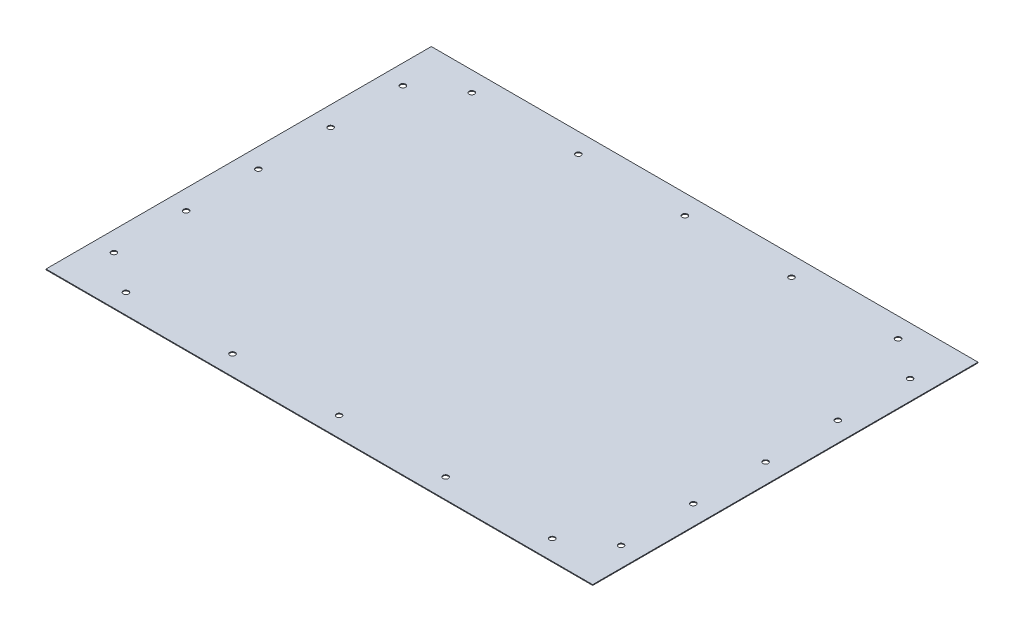
ISO-10303-21;
HEADER;
FILE_DESCRIPTION(('STEP AP214'),'2;1');
FILE_NAME('part.step','',(''),(''),'','','');
FILE_SCHEMA(('AUTOMOTIVE_DESIGN { 1 0 10303 214 1 1 1 1 }'));
ENDSEC;
DATA;
#1=APPLICATION_CONTEXT('core data for automotive mechanical design processes');
#2=APPLICATION_PROTOCOL_DEFINITION('international standard','automotive_design',2000,#1);
#3=PRODUCT_CONTEXT('',#1,'mechanical');
#4=PRODUCT('Part','Part','',(#3));
#5=PRODUCT_RELATED_PRODUCT_CATEGORY('part','',(#4));
#6=PRODUCT_DEFINITION_FORMATION('','',#4);
#7=PRODUCT_DEFINITION_CONTEXT('part definition',#1,'design');
#8=PRODUCT_DEFINITION('design','',#6,#7);
#9=PRODUCT_DEFINITION_SHAPE('','',#8);
#10=(LENGTH_UNIT() NAMED_UNIT(*) SI_UNIT(.MILLI.,.METRE.));
#11=(NAMED_UNIT(*) PLANE_ANGLE_UNIT() SI_UNIT($,.RADIAN.));
#12=(NAMED_UNIT(*) SI_UNIT($,.STERADIAN.) SOLID_ANGLE_UNIT());
#13=UNCERTAINTY_MEASURE_WITH_UNIT(LENGTH_MEASURE(1.E-05),#10,'distance_accuracy_value','');
#14=(GEOMETRIC_REPRESENTATION_CONTEXT(3) GLOBAL_UNCERTAINTY_ASSIGNED_CONTEXT((#13)) GLOBAL_UNIT_ASSIGNED_CONTEXT((#10,
#11,#12)) REPRESENTATION_CONTEXT('',''));
#15=CARTESIAN_POINT('',(0.,0.,0.));
#16=DIRECTION('',(0.,0.,1.));
#17=DIRECTION('',(1.,0.,0.));
#18=AXIS2_PLACEMENT_3D('',#15,#16,#17);
#19=CARTESIAN_POINT('',(0.,0.635,0.));
#20=DIRECTION('',(0.,1.,0.));
#21=DIRECTION('',(0.,0.,1.));
#22=AXIS2_PLACEMENT_3D('',#19,#20,#21);
#23=PLANE('',#22);
#24=CARTESIAN_POINT('',(224.699378881987,0.635,-33.2391304347827));
#25=DIRECTION('',(0.,-1.,0.));
#26=DIRECTION('',(0.,0.,1.));
#27=AXIS2_PLACEMENT_3D('',#24,#25,#26);
#28=CIRCLE('',#27,2.248);
#29=CARTESIAN_POINT('',(224.699378881987,0.635,-30.9911304347827));
#30=VERTEX_POINT('',#29);
#31=EDGE_CURVE('E167',#30,#30,#28,.T.);
#32=ORIENTED_EDGE('',*,*,#31,.T.);
#33=EDGE_LOOP('',(#32));
#34=FACE_BOUND('',#33,.T.);
#35=CARTESIAN_POINT('',(224.699378881987,0.635,86.7608695652173));
#36=DIRECTION('',(0.,-1.,0.));
#37=DIRECTION('',(0.,0.,1.));
#38=AXIS2_PLACEMENT_3D('',#35,#36,#37);
#39=CIRCLE('',#38,2.248);
#40=CARTESIAN_POINT('',(224.699378881987,0.635,89.0088695652173));
#41=VERTEX_POINT('',#40);
#42=EDGE_CURVE('E161',#41,#41,#39,.T.);
#43=ORIENTED_EDGE('',*,*,#42,.T.);
#44=EDGE_LOOP('',(#43));
#45=FACE_BOUND('',#44,.T.);
#46=CARTESIAN_POINT('',(-196.500621118013,0.635,-93.2391304347826));
#47=DIRECTION('',(0.,1.,0.));
#48=DIRECTION('',(0.,0.,1.));
#49=AXIS2_PLACEMENT_3D('',#46,#47,#48);
#50=CIRCLE('',#49,2.248);
#51=CARTESIAN_POINT('',(-196.500621118013,0.635,-90.9911304347826));
#52=VERTEX_POINT('',#51);
#53=EDGE_CURVE('E44',#52,#52,#50,.T.);
#54=ORIENTED_EDGE('',*,*,#53,.F.);
#55=EDGE_LOOP('',(#54));
#56=FACE_BOUND('',#55,.T.);
#57=CARTESIAN_POINT('',(-196.500621118013,0.635,-33.2391304347826));
#58=DIRECTION('',(0.,1.,0.));
#59=DIRECTION('',(0.,0.,1.));
#60=AXIS2_PLACEMENT_3D('',#57,#58,#59);
#61=CIRCLE('',#60,2.248);
#62=CARTESIAN_POINT('',(-196.500621118013,0.635,-30.9911304347826));
#63=VERTEX_POINT('',#62);
#64=EDGE_CURVE('E145',#63,#63,#61,.T.);
#65=ORIENTED_EDGE('',*,*,#64,.F.);
#66=EDGE_LOOP('',(#65));
#67=FACE_BOUND('',#66,.T.);
#68=CARTESIAN_POINT('',(-196.500621118013,0.635,26.7608695652174));
#69=DIRECTION('',(0.,1.,0.));
#70=DIRECTION('',(0.,0.,1.));
#71=AXIS2_PLACEMENT_3D('',#68,#69,#70);
#72=CIRCLE('',#71,2.248);
#73=CARTESIAN_POINT('',(-196.500621118013,0.635,29.0088695652174));
#74=VERTEX_POINT('',#73);
#75=EDGE_CURVE('E134',#74,#74,#72,.T.);
#76=ORIENTED_EDGE('',*,*,#75,.F.);
#77=EDGE_LOOP('',(#76));
#78=FACE_BOUND('',#77,.T.);
#79=CARTESIAN_POINT('',(191.099378881987,0.635,-116.839130434783));
#80=DIRECTION('',(0.,-1.,0.));
#81=DIRECTION('',(0.,0.,-1.));
#82=AXIS2_PLACEMENT_3D('',#79,#80,#81);
#83=CIRCLE('',#82,2.248);
#84=CARTESIAN_POINT('',(191.099378881987,0.635,-119.087130434783));
#85=VERTEX_POINT('',#84);
#86=EDGE_CURVE('E138',#85,#85,#83,.T.);
#87=ORIENTED_EDGE('',*,*,#86,.T.);
#88=EDGE_LOOP('',(#87));
#89=FACE_BOUND('',#88,.T.);
#90=CARTESIAN_POINT('',(14.0993788819874,0.635,-116.839130434783));
#91=DIRECTION('',(0.,-1.,0.));
#92=DIRECTION('',(0.,0.,-1.));
#93=AXIS2_PLACEMENT_3D('',#90,#91,#92);
#94=CIRCLE('',#93,2.248);
#95=CARTESIAN_POINT('',(14.0993788819874,0.635,-119.087130434783));
#96=VERTEX_POINT('',#95);
#97=EDGE_CURVE('E200',#96,#96,#94,.T.);
#98=ORIENTED_EDGE('',*,*,#97,.T.);
#99=EDGE_LOOP('',(#98));
#100=FACE_BOUND('',#99,.T.);
#101=CARTESIAN_POINT('',(-162.900621118013,0.635,-116.839130434783));
#102=DIRECTION('',(0.,-1.,0.));
#103=DIRECTION('',(0.,0.,-1.));
#104=AXIS2_PLACEMENT_3D('',#101,#102,#103);
#105=CIRCLE('',#104,2.248);
#106=CARTESIAN_POINT('',(-162.900621118013,0.635,-119.087130434783));
#107=VERTEX_POINT('',#106);
#108=EDGE_CURVE('E212',#107,#107,#105,.T.);
#109=ORIENTED_EDGE('',*,*,#108,.T.);
#110=EDGE_LOOP('',(#109));
#111=FACE_BOUND('',#110,.T.);
#112=CARTESIAN_POINT('',(-74.4006211180126,0.635,170.360869565217));
#113=DIRECTION('',(0.,1.,0.));
#114=DIRECTION('',(0.,0.,1.));
#115=AXIS2_PLACEMENT_3D('',#112,#113,#114);
#116=CIRCLE('',#115,2.248);
#117=CARTESIAN_POINT('',(-74.4006211180126,0.635,172.608869565217));
#118=VERTEX_POINT('',#117);
#119=EDGE_CURVE('E223',#118,#118,#116,.T.);
#120=ORIENTED_EDGE('',*,*,#119,.F.);
#121=EDGE_LOOP('',(#120));
#122=FACE_BOUND('',#121,.T.);
#123=CARTESIAN_POINT('',(-162.900621118013,0.635,170.360869565217));
#124=DIRECTION('',(0.,1.,0.));
#125=DIRECTION('',(0.,0.,1.));
#126=AXIS2_PLACEMENT_3D('',#123,#124,#125);
#127=CIRCLE('',#126,2.248);
#128=CARTESIAN_POINT('',(-162.900621118013,0.635,172.608869565217));
#129=VERTEX_POINT('',#128);
#130=EDGE_CURVE('E226',#129,#129,#127,.T.);
#131=ORIENTED_EDGE('',*,*,#130,.F.);
#132=EDGE_LOOP('',(#131));
#133=FACE_BOUND('',#132,.T.);
#134=DIRECTION('',(0.,0.,1.));
#135=VECTOR('',#134,1.);
#136=CARTESIAN_POINT('',(-212.900621118013,0.635,-133.239130434783));
#137=LINE('',#136,#135);
#138=CARTESIAN_POINT('',(-212.900621118013,0.635,-133.239130434783));
#139=VERTEX_POINT('',#138);
#140=CARTESIAN_POINT('',(-212.900621118013,0.635,186.760869565217));
#141=VERTEX_POINT('',#140);
#142=EDGE_CURVE('E87',#139,#141,#137,.T.);
#143=ORIENTED_EDGE('',*,*,#142,.T.);
#144=DIRECTION('',(1.,0.,0.));
#145=VECTOR('',#144,1.);
#146=CARTESIAN_POINT('',(-212.900621118013,0.635,186.760869565217));
#147=LINE('',#146,#145);
#148=CARTESIAN_POINT('',(241.099378881987,0.635,186.760869565217));
#149=VERTEX_POINT('',#148);
#150=EDGE_CURVE('E79',#141,#149,#147,.T.);
#151=ORIENTED_EDGE('',*,*,#150,.T.);
#152=DIRECTION('',(0.,0.,1.));
#153=VECTOR('',#152,1.);
#154=CARTESIAN_POINT('',(241.099378881987,0.635,-133.239130434783));
#155=LINE('',#154,#153);
#156=CARTESIAN_POINT('',(241.099378881987,0.635,-133.239130434783));
#157=VERTEX_POINT('',#156);
#158=EDGE_CURVE('E86',#157,#149,#155,.T.);
#159=ORIENTED_EDGE('',*,*,#158,.F.);
#160=DIRECTION('',(1.,0.,0.));
#161=VECTOR('',#160,1.);
#162=CARTESIAN_POINT('',(-212.900621118013,0.635,-133.239130434783));
#163=LINE('',#162,#161);
#164=EDGE_CURVE('E99',#139,#157,#163,.T.);
#165=ORIENTED_EDGE('',*,*,#164,.F.);
#166=EDGE_LOOP('',(#143,#151,#159,#165));
#167=FACE_BOUND('',#166,.T.);
#168=CARTESIAN_POINT('',(14.0993788819874,0.635,170.360869565217));
#169=DIRECTION('',(0.,1.,0.));
#170=DIRECTION('',(0.,0.,1.));
#171=AXIS2_PLACEMENT_3D('',#168,#169,#170);
#172=CIRCLE('',#171,2.248);
#173=CARTESIAN_POINT('',(14.0993788819874,0.635,172.608869565217));
#174=VERTEX_POINT('',#173);
#175=EDGE_CURVE('E119',#174,#174,#172,.T.);
#176=ORIENTED_EDGE('',*,*,#175,.F.);
#177=EDGE_LOOP('',(#176));
#178=FACE_BOUND('',#177,.T.);
#179=CARTESIAN_POINT('',(102.599378881987,0.635,170.360869565217));
#180=DIRECTION('',(0.,1.,0.));
#181=DIRECTION('',(0.,0.,1.));
#182=AXIS2_PLACEMENT_3D('',#179,#180,#181);
#183=CIRCLE('',#182,2.248);
#184=CARTESIAN_POINT('',(102.599378881987,0.635,172.608869565217));
#185=VERTEX_POINT('',#184);
#186=EDGE_CURVE('E125',#185,#185,#183,.T.);
#187=ORIENTED_EDGE('',*,*,#186,.F.);
#188=EDGE_LOOP('',(#187));
#189=FACE_BOUND('',#188,.T.);
#190=CARTESIAN_POINT('',(191.099378881987,0.635,170.360869565217));
#191=DIRECTION('',(0.,1.,0.));
#192=DIRECTION('',(0.,0.,1.));
#193=AXIS2_PLACEMENT_3D('',#190,#191,#192);
#194=CIRCLE('',#193,2.248);
#195=CARTESIAN_POINT('',(191.099378881987,0.635,172.608869565217));
#196=VERTEX_POINT('',#195);
#197=EDGE_CURVE('E131',#196,#196,#194,.T.);
#198=ORIENTED_EDGE('',*,*,#197,.F.);
#199=EDGE_LOOP('',(#198));
#200=FACE_BOUND('',#199,.T.);
#201=CARTESIAN_POINT('',(-74.4006211180126,0.635,-116.839130434783));
#202=DIRECTION('',(0.,-1.,0.));
#203=DIRECTION('',(0.,0.,-1.));
#204=AXIS2_PLACEMENT_3D('',#201,#202,#203);
#205=CIRCLE('',#204,2.248);
#206=CARTESIAN_POINT('',(-74.4006211180126,0.635,-119.087130434783));
#207=VERTEX_POINT('',#206);
#208=EDGE_CURVE('E206',#207,#207,#205,.T.);
#209=ORIENTED_EDGE('',*,*,#208,.T.);
#210=EDGE_LOOP('',(#209));
#211=FACE_BOUND('',#210,.T.);
#212=CARTESIAN_POINT('',(102.599378881987,0.635,-116.839130434783));
#213=DIRECTION('',(0.,-1.,0.));
#214=DIRECTION('',(0.,0.,-1.));
#215=AXIS2_PLACEMENT_3D('',#212,#213,#214);
#216=CIRCLE('',#215,2.248);
#217=CARTESIAN_POINT('',(102.599378881987,0.635,-119.087130434783));
#218=VERTEX_POINT('',#217);
#219=EDGE_CURVE('E194',#218,#218,#216,.T.);
#220=ORIENTED_EDGE('',*,*,#219,.T.);
#221=EDGE_LOOP('',(#220));
#222=FACE_BOUND('',#221,.T.);
#223=CARTESIAN_POINT('',(-196.500621118013,0.635,146.760869565217));
#224=DIRECTION('',(0.,1.,0.));
#225=DIRECTION('',(0.,0.,1.));
#226=AXIS2_PLACEMENT_3D('',#223,#224,#225);
#227=CIRCLE('',#226,2.248);
#228=CARTESIAN_POINT('',(-196.500621118013,0.635,149.008869565217));
#229=VERTEX_POINT('',#228);
#230=EDGE_CURVE('E139',#229,#229,#227,.T.);
#231=ORIENTED_EDGE('',*,*,#230,.F.);
#232=EDGE_LOOP('',(#231));
#233=FACE_BOUND('',#232,.T.);
#234=CARTESIAN_POINT('',(-196.500621118013,0.635,86.7608695652174));
#235=DIRECTION('',(0.,1.,0.));
#236=DIRECTION('',(0.,0.,1.));
#237=AXIS2_PLACEMENT_3D('',#234,#235,#236);
#238=CIRCLE('',#237,2.248);
#239=CARTESIAN_POINT('',(-196.500621118013,0.635,89.0088695652174));
#240=VERTEX_POINT('',#239);
#241=EDGE_CURVE('E156',#240,#240,#238,.T.);
#242=ORIENTED_EDGE('',*,*,#241,.F.);
#243=EDGE_LOOP('',(#242));
#244=FACE_BOUND('',#243,.T.);
#245=CARTESIAN_POINT('',(224.699378881987,0.635,146.760869565217));
#246=DIRECTION('',(0.,-1.,0.));
#247=DIRECTION('',(0.,0.,1.));
#248=AXIS2_PLACEMENT_3D('',#245,#246,#247);
#249=CIRCLE('',#248,2.248);
#250=CARTESIAN_POINT('',(224.699378881987,0.635,149.008869565217));
#251=VERTEX_POINT('',#250);
#252=EDGE_CURVE('E157',#251,#251,#249,.T.);
#253=ORIENTED_EDGE('',*,*,#252,.T.);
#254=EDGE_LOOP('',(#253));
#255=FACE_BOUND('',#254,.T.);
#256=CARTESIAN_POINT('',(224.699378881987,0.635,26.7608695652173));
#257=DIRECTION('',(0.,-1.,0.));
#258=DIRECTION('',(0.,0.,1.));
#259=AXIS2_PLACEMENT_3D('',#256,#257,#258);
#260=CIRCLE('',#259,2.248);
#261=CARTESIAN_POINT('',(224.699378881987,0.635,29.0088695652173));
#262=VERTEX_POINT('',#261);
#263=EDGE_CURVE('E164',#262,#262,#260,.T.);
#264=ORIENTED_EDGE('',*,*,#263,.T.);
#265=EDGE_LOOP('',(#264));
#266=FACE_BOUND('',#265,.T.);
#267=CARTESIAN_POINT('',(224.699378881987,0.635,-93.2391304347827));
#268=DIRECTION('',(0.,-1.,0.));
#269=DIRECTION('',(0.,0.,1.));
#270=AXIS2_PLACEMENT_3D('',#267,#268,#269);
#271=CIRCLE('',#270,2.248);
#272=CARTESIAN_POINT('',(224.699378881987,0.635,-90.9911304347827));
#273=VERTEX_POINT('',#272);
#274=EDGE_CURVE('E177',#273,#273,#271,.T.);
#275=ORIENTED_EDGE('',*,*,#274,.T.);
#276=EDGE_LOOP('',(#275));
#277=FACE_BOUND('',#276,.T.);
#278=ADVANCED_FACE('F34',(#34,#45,#56,#67,#78,#89,#100,#111,#122,#133,#167,#178,#189,#200,#211,
#222,#233,#244,#255,#266,#277),#23,.T.);
#279=CARTESIAN_POINT('',(0.,0.,0.));
#280=DIRECTION('',(0.,1.,0.));
#281=DIRECTION('',(0.,0.,1.));
#282=AXIS2_PLACEMENT_3D('',#279,#280,#281);
#283=PLANE('',#282);
#284=CARTESIAN_POINT('',(224.699378881987,0.,-33.2391304347827));
#285=DIRECTION('',(0.,1.,0.));
#286=DIRECTION('',(0.,0.,1.));
#287=AXIS2_PLACEMENT_3D('',#284,#285,#286);
#288=CIRCLE('',#287,2.248);
#289=CARTESIAN_POINT('',(224.699378881987,0.,-30.9911304347827));
#290=VERTEX_POINT('',#289);
#291=EDGE_CURVE('E165',#290,#290,#288,.F.);
#292=ORIENTED_EDGE('',*,*,#291,.F.);
#293=EDGE_LOOP('',(#292));
#294=FACE_BOUND('',#293,.T.);
#295=CARTESIAN_POINT('',(224.699378881987,0.,86.7608695652173));
#296=DIRECTION('',(0.,1.,0.));
#297=DIRECTION('',(0.,0.,1.));
#298=AXIS2_PLACEMENT_3D('',#295,#296,#297);
#299=CIRCLE('',#298,2.248);
#300=CARTESIAN_POINT('',(224.699378881987,0.,89.0088695652173));
#301=VERTEX_POINT('',#300);
#302=EDGE_CURVE('E158',#301,#301,#299,.F.);
#303=ORIENTED_EDGE('',*,*,#302,.F.);
#304=EDGE_LOOP('',(#303));
#305=FACE_BOUND('',#304,.T.);
#306=CARTESIAN_POINT('',(-196.500621118013,0.,-93.2391304347826));
#307=DIRECTION('',(0.,1.,0.));
#308=DIRECTION('',(0.,0.,1.));
#309=AXIS2_PLACEMENT_3D('',#306,#307,#308);
#310=CIRCLE('',#309,2.248);
#311=CARTESIAN_POINT('',(-196.500621118013,0.,-90.9911304347826));
#312=VERTEX_POINT('',#311);
#313=EDGE_CURVE('E11',#312,#312,#310,.T.);
#314=ORIENTED_EDGE('',*,*,#313,.T.);
#315=EDGE_LOOP('',(#314));
#316=FACE_BOUND('',#315,.T.);
#317=CARTESIAN_POINT('',(-196.500621118013,0.,-33.2391304347826));
#318=DIRECTION('',(0.,1.,0.));
#319=DIRECTION('',(0.,0.,1.));
#320=AXIS2_PLACEMENT_3D('',#317,#318,#319);
#321=CIRCLE('',#320,2.248);
#322=CARTESIAN_POINT('',(-196.500621118013,0.,-30.9911304347826));
#323=VERTEX_POINT('',#322);
#324=EDGE_CURVE('E148',#323,#323,#321,.T.);
#325=ORIENTED_EDGE('',*,*,#324,.T.);
#326=EDGE_LOOP('',(#325));
#327=FACE_BOUND('',#326,.T.);
#328=CARTESIAN_POINT('',(-196.500621118013,0.,26.7608695652174));
#329=DIRECTION('',(0.,1.,0.));
#330=DIRECTION('',(0.,0.,1.));
#331=AXIS2_PLACEMENT_3D('',#328,#329,#330);
#332=CIRCLE('',#331,2.248);
#333=CARTESIAN_POINT('',(-196.500621118013,0.,29.0088695652174));
#334=VERTEX_POINT('',#333);
#335=EDGE_CURVE('E142',#334,#334,#332,.T.);
#336=ORIENTED_EDGE('',*,*,#335,.T.);
#337=EDGE_LOOP('',(#336));
#338=FACE_BOUND('',#337,.T.);
#339=CARTESIAN_POINT('',(191.099378881987,0.,-116.839130434783));
#340=DIRECTION('',(0.,-1.,0.));
#341=DIRECTION('',(0.,0.,-1.));
#342=AXIS2_PLACEMENT_3D('',#339,#340,#341);
#343=CIRCLE('',#342,2.248);
#344=CARTESIAN_POINT('',(191.099378881987,0.,-119.087130434783));
#345=VERTEX_POINT('',#344);
#346=EDGE_CURVE('E191',#345,#345,#343,.T.);
#347=ORIENTED_EDGE('',*,*,#346,.F.);
#348=EDGE_LOOP('',(#347));
#349=FACE_BOUND('',#348,.T.);
#350=CARTESIAN_POINT('',(14.0993788819874,0.,-116.839130434783));
#351=DIRECTION('',(0.,-1.,0.));
#352=DIRECTION('',(0.,0.,-1.));
#353=AXIS2_PLACEMENT_3D('',#350,#351,#352);
#354=CIRCLE('',#353,2.248);
#355=CARTESIAN_POINT('',(14.0993788819874,0.,-119.087130434783));
#356=VERTEX_POINT('',#355);
#357=EDGE_CURVE('E203',#356,#356,#354,.T.);
#358=ORIENTED_EDGE('',*,*,#357,.F.);
#359=EDGE_LOOP('',(#358));
#360=FACE_BOUND('',#359,.T.);
#361=CARTESIAN_POINT('',(-162.900621118013,0.,-116.839130434783));
#362=DIRECTION('',(0.,-1.,0.));
#363=DIRECTION('',(0.,0.,-1.));
#364=AXIS2_PLACEMENT_3D('',#361,#362,#363);
#365=CIRCLE('',#364,2.248);
#366=CARTESIAN_POINT('',(-162.900621118013,0.,-119.087130434783));
#367=VERTEX_POINT('',#366);
#368=EDGE_CURVE('E215',#367,#367,#365,.T.);
#369=ORIENTED_EDGE('',*,*,#368,.F.);
#370=EDGE_LOOP('',(#369));
#371=FACE_BOUND('',#370,.T.);
#372=CARTESIAN_POINT('',(-74.4006211180126,0.,170.360869565217));
#373=DIRECTION('',(0.,1.,0.));
#374=DIRECTION('',(0.,0.,1.));
#375=AXIS2_PLACEMENT_3D('',#372,#373,#374);
#376=CIRCLE('',#375,2.248);
#377=CARTESIAN_POINT('',(-74.4006211180126,0.,172.608869565217));
#378=VERTEX_POINT('',#377);
#379=EDGE_CURVE('E218',#378,#378,#376,.T.);
#380=ORIENTED_EDGE('',*,*,#379,.T.);
#381=EDGE_LOOP('',(#380));
#382=FACE_BOUND('',#381,.T.);
#383=CARTESIAN_POINT('',(-162.900621118013,0.,170.360869565217));
#384=DIRECTION('',(0.,1.,0.));
#385=DIRECTION('',(0.,0.,1.));
#386=AXIS2_PLACEMENT_3D('',#383,#384,#385);
#387=CIRCLE('',#386,2.248);
#388=CARTESIAN_POINT('',(-162.900621118013,0.,172.608869565217));
#389=VERTEX_POINT('',#388);
#390=EDGE_CURVE('E106',#389,#389,#387,.T.);
#391=ORIENTED_EDGE('',*,*,#390,.T.);
#392=EDGE_LOOP('',(#391));
#393=FACE_BOUND('',#392,.T.);
#394=DIRECTION('',(0.,0.,1.));
#395=VECTOR('',#394,1.);
#396=CARTESIAN_POINT('',(-212.900621118013,0.,-133.239130434783));
#397=LINE('',#396,#395);
#398=CARTESIAN_POINT('',(-212.900621118013,0.,-133.239130434783));
#399=VERTEX_POINT('',#398);
#400=CARTESIAN_POINT('',(-212.900621118013,0.,186.760869565217));
#401=VERTEX_POINT('',#400);
#402=EDGE_CURVE('E104',#399,#401,#397,.T.);
#403=ORIENTED_EDGE('',*,*,#402,.F.);
#404=DIRECTION('',(1.,0.,0.));
#405=VECTOR('',#404,1.);
#406=CARTESIAN_POINT('',(-212.900621118013,0.,-133.239130434783));
#407=LINE('',#406,#405);
#408=CARTESIAN_POINT('',(241.099378881987,0.,-133.239130434783));
#409=VERTEX_POINT('',#408);
#410=EDGE_CURVE('E110',#399,#409,#407,.T.);
#411=ORIENTED_EDGE('',*,*,#410,.T.);
#412=DIRECTION('',(0.,0.,1.));
#413=VECTOR('',#412,1.);
#414=CARTESIAN_POINT('',(241.099378881987,0.,-133.239130434783));
#415=LINE('',#414,#413);
#416=CARTESIAN_POINT('',(241.099378881987,0.,186.760869565217));
#417=VERTEX_POINT('',#416);
#418=EDGE_CURVE('E108',#409,#417,#415,.T.);
#419=ORIENTED_EDGE('',*,*,#418,.T.);
#420=DIRECTION('',(1.,0.,0.));
#421=VECTOR('',#420,1.);
#422=CARTESIAN_POINT('',(-212.900621118013,0.,186.760869565217));
#423=LINE('',#422,#421);
#424=EDGE_CURVE('E93',#401,#417,#423,.T.);
#425=ORIENTED_EDGE('',*,*,#424,.F.);
#426=EDGE_LOOP('',(#403,#411,#419,#425));
#427=FACE_BOUND('',#426,.T.);
#428=CARTESIAN_POINT('',(14.0993788819874,0.,170.360869565217));
#429=DIRECTION('',(0.,1.,0.));
#430=DIRECTION('',(0.,0.,1.));
#431=AXIS2_PLACEMENT_3D('',#428,#429,#430);
#432=CIRCLE('',#431,2.248);
#433=CARTESIAN_POINT('',(14.0993788819874,0.,172.608869565217));
#434=VERTEX_POINT('',#433);
#435=EDGE_CURVE('E116',#434,#434,#432,.T.);
#436=ORIENTED_EDGE('',*,*,#435,.T.);
#437=EDGE_LOOP('',(#436));
#438=FACE_BOUND('',#437,.T.);
#439=CARTESIAN_POINT('',(102.599378881987,0.,170.360869565217));
#440=DIRECTION('',(0.,1.,0.));
#441=DIRECTION('',(0.,0.,1.));
#442=AXIS2_PLACEMENT_3D('',#439,#440,#441);
#443=CIRCLE('',#442,2.248);
#444=CARTESIAN_POINT('',(102.599378881987,0.,172.608869565217));
#445=VERTEX_POINT('',#444);
#446=EDGE_CURVE('E122',#445,#445,#443,.T.);
#447=ORIENTED_EDGE('',*,*,#446,.T.);
#448=EDGE_LOOP('',(#447));
#449=FACE_BOUND('',#448,.T.);
#450=CARTESIAN_POINT('',(191.099378881987,0.,170.360869565217));
#451=DIRECTION('',(0.,1.,0.));
#452=DIRECTION('',(0.,0.,1.));
#453=AXIS2_PLACEMENT_3D('',#450,#451,#452);
#454=CIRCLE('',#453,2.248);
#455=CARTESIAN_POINT('',(191.099378881987,0.,172.608869565217));
#456=VERTEX_POINT('',#455);
#457=EDGE_CURVE('E128',#456,#456,#454,.T.);
#458=ORIENTED_EDGE('',*,*,#457,.T.);
#459=EDGE_LOOP('',(#458));
#460=FACE_BOUND('',#459,.T.);
#461=CARTESIAN_POINT('',(-74.4006211180126,0.,-116.839130434783));
#462=DIRECTION('',(0.,-1.,0.));
#463=DIRECTION('',(0.,0.,-1.));
#464=AXIS2_PLACEMENT_3D('',#461,#462,#463);
#465=CIRCLE('',#464,2.248);
#466=CARTESIAN_POINT('',(-74.4006211180126,0.,-119.087130434783));
#467=VERTEX_POINT('',#466);
#468=EDGE_CURVE('E209',#467,#467,#465,.T.);
#469=ORIENTED_EDGE('',*,*,#468,.F.);
#470=EDGE_LOOP('',(#469));
#471=FACE_BOUND('',#470,.T.);
#472=CARTESIAN_POINT('',(102.599378881987,0.,-116.839130434783));
#473=DIRECTION('',(0.,-1.,0.));
#474=DIRECTION('',(0.,0.,-1.));
#475=AXIS2_PLACEMENT_3D('',#472,#473,#474);
#476=CIRCLE('',#475,2.248);
#477=CARTESIAN_POINT('',(102.599378881987,0.,-119.087130434783));
#478=VERTEX_POINT('',#477);
#479=EDGE_CURVE('E197',#478,#478,#476,.T.);
#480=ORIENTED_EDGE('',*,*,#479,.F.);
#481=EDGE_LOOP('',(#480));
#482=FACE_BOUND('',#481,.T.);
#483=CARTESIAN_POINT('',(-196.500621118013,0.,146.760869565217));
#484=DIRECTION('',(0.,1.,0.));
#485=DIRECTION('',(0.,0.,1.));
#486=AXIS2_PLACEMENT_3D('',#483,#484,#485);
#487=CIRCLE('',#486,2.248);
#488=CARTESIAN_POINT('',(-196.500621118013,0.,149.008869565217));
#489=VERTEX_POINT('',#488);
#490=EDGE_CURVE('E135',#489,#489,#487,.T.);
#491=ORIENTED_EDGE('',*,*,#490,.T.);
#492=EDGE_LOOP('',(#491));
#493=FACE_BOUND('',#492,.T.);
#494=CARTESIAN_POINT('',(-196.500621118013,0.,86.7608695652174));
#495=DIRECTION('',(0.,1.,0.));
#496=DIRECTION('',(0.,0.,1.));
#497=AXIS2_PLACEMENT_3D('',#494,#495,#496);
#498=CIRCLE('',#497,2.248);
#499=CARTESIAN_POINT('',(-196.500621118013,0.,89.0088695652174));
#500=VERTEX_POINT('',#499);
#501=EDGE_CURVE('E186',#500,#500,#498,.T.);
#502=ORIENTED_EDGE('',*,*,#501,.T.);
#503=EDGE_LOOP('',(#502));
#504=FACE_BOUND('',#503,.T.);
#505=CARTESIAN_POINT('',(224.699378881987,0.,146.760869565217));
#506=DIRECTION('',(0.,1.,0.));
#507=DIRECTION('',(0.,0.,1.));
#508=AXIS2_PLACEMENT_3D('',#505,#506,#507);
#509=CIRCLE('',#508,2.248);
#510=CARTESIAN_POINT('',(224.699378881987,0.,149.008869565217));
#511=VERTEX_POINT('',#510);
#512=EDGE_CURVE('E153',#511,#511,#509,.F.);
#513=ORIENTED_EDGE('',*,*,#512,.F.);
#514=EDGE_LOOP('',(#513));
#515=FACE_BOUND('',#514,.T.);
#516=CARTESIAN_POINT('',(224.699378881987,0.,26.7608695652173));
#517=DIRECTION('',(0.,1.,0.));
#518=DIRECTION('',(0.,0.,1.));
#519=AXIS2_PLACEMENT_3D('',#516,#517,#518);
#520=CIRCLE('',#519,2.248);
#521=CARTESIAN_POINT('',(224.699378881987,0.,29.0088695652173));
#522=VERTEX_POINT('',#521);
#523=EDGE_CURVE('E162',#522,#522,#520,.F.);
#524=ORIENTED_EDGE('',*,*,#523,.F.);
#525=EDGE_LOOP('',(#524));
#526=FACE_BOUND('',#525,.T.);
#527=CARTESIAN_POINT('',(224.699378881987,0.,-93.2391304347827));
#528=DIRECTION('',(0.,1.,0.));
#529=DIRECTION('',(0.,0.,1.));
#530=AXIS2_PLACEMENT_3D('',#527,#528,#529);
#531=CIRCLE('',#530,2.248);
#532=CARTESIAN_POINT('',(224.699378881987,0.,-90.9911304347827));
#533=VERTEX_POINT('',#532);
#534=EDGE_CURVE('E38',#533,#533,#531,.F.);
#535=ORIENTED_EDGE('',*,*,#534,.F.);
#536=EDGE_LOOP('',(#535));
#537=FACE_BOUND('',#536,.T.);
#538=ADVANCED_FACE('F235',(#294,#305,#316,#327,#338,#349,#360,#371,#382,#393,#427,#438,#449,
#460,#471,#482,#493,#504,#515,#526,#537),#283,.F.);
#539=CARTESIAN_POINT('',(-212.900621118013,0.635,-133.239130434783));
#540=DIRECTION('',(1.,0.,0.));
#541=DIRECTION('',(0.,0.,-1.));
#542=AXIS2_PLACEMENT_3D('',#539,#540,#541);
#543=PLANE('',#542);
#544=ORIENTED_EDGE('',*,*,#402,.T.);
#545=DIRECTION('',(0.,-1.,0.));
#546=VECTOR('',#545,1.);
#547=CARTESIAN_POINT('',(-212.900621118013,0.635,186.760869565217));
#548=LINE('',#547,#546);
#549=EDGE_CURVE('E96',#141,#401,#548,.T.);
#550=ORIENTED_EDGE('',*,*,#549,.F.);
#551=ORIENTED_EDGE('',*,*,#142,.F.);
#552=DIRECTION('',(0.,-1.,0.));
#553=VECTOR('',#552,1.);
#554=CARTESIAN_POINT('',(-212.900621118013,0.635,-133.239130434783));
#555=LINE('',#554,#553);
#556=EDGE_CURVE('E53',#139,#399,#555,.T.);
#557=ORIENTED_EDGE('',*,*,#556,.T.);
#558=EDGE_LOOP('',(#544,#550,#551,#557));
#559=FACE_BOUND('',#558,.T.);
#560=ADVANCED_FACE('F240',(#559),#543,.F.);
#561=CARTESIAN_POINT('',(-212.900621118013,0.635,186.760869565217));
#562=DIRECTION('',(0.,0.,-1.));
#563=DIRECTION('',(-1.,0.,0.));
#564=AXIS2_PLACEMENT_3D('',#561,#562,#563);
#565=PLANE('',#564);
#566=ORIENTED_EDGE('',*,*,#424,.T.);
#567=DIRECTION('',(0.,-1.,0.));
#568=VECTOR('',#567,1.);
#569=CARTESIAN_POINT('',(241.099378881987,0.635,186.760869565217));
#570=LINE('',#569,#568);
#571=EDGE_CURVE('E91',#149,#417,#570,.T.);
#572=ORIENTED_EDGE('',*,*,#571,.F.);
#573=ORIENTED_EDGE('',*,*,#150,.F.);
#574=ORIENTED_EDGE('',*,*,#549,.T.);
#575=EDGE_LOOP('',(#566,#572,#573,#574));
#576=FACE_BOUND('',#575,.T.);
#577=ADVANCED_FACE('F92',(#576),#565,.F.);
#578=CARTESIAN_POINT('',(241.099378881987,0.635,-133.239130434783));
#579=DIRECTION('',(1.,0.,0.));
#580=DIRECTION('',(0.,0.,-1.));
#581=AXIS2_PLACEMENT_3D('',#578,#579,#580);
#582=PLANE('',#581);
#583=ORIENTED_EDGE('',*,*,#418,.F.);
#584=DIRECTION('',(0.,-1.,0.));
#585=VECTOR('',#584,1.);
#586=CARTESIAN_POINT('',(241.099378881987,0.635,-133.239130434783));
#587=LINE('',#586,#585);
#588=EDGE_CURVE('E67',#157,#409,#587,.T.);
#589=ORIENTED_EDGE('',*,*,#588,.F.);
#590=ORIENTED_EDGE('',*,*,#158,.T.);
#591=ORIENTED_EDGE('',*,*,#571,.T.);
#592=EDGE_LOOP('',(#583,#589,#590,#591));
#593=FACE_BOUND('',#592,.T.);
#594=ADVANCED_FACE('F98',(#593),#582,.T.);
#595=CARTESIAN_POINT('',(-212.900621118013,0.635,-133.239130434783));
#596=DIRECTION('',(0.,0.,-1.));
#597=DIRECTION('',(-1.,0.,0.));
#598=AXIS2_PLACEMENT_3D('',#595,#596,#597);
#599=PLANE('',#598);
#600=ORIENTED_EDGE('',*,*,#410,.F.);
#601=ORIENTED_EDGE('',*,*,#556,.F.);
#602=ORIENTED_EDGE('',*,*,#164,.T.);
#603=ORIENTED_EDGE('',*,*,#588,.T.);
#604=EDGE_LOOP('',(#600,#601,#602,#603));
#605=FACE_BOUND('',#604,.T.);
#606=ADVANCED_FACE('F247',(#605),#599,.T.);
#607=CARTESIAN_POINT('',(-162.900621118013,0.,170.360869565217));
#608=DIRECTION('',(0.,1.,0.));
#609=DIRECTION('',(0.,0.,1.));
#610=AXIS2_PLACEMENT_3D('',#607,#608,#609);
#611=CYLINDRICAL_SURFACE('',#610,2.248);
#612=ORIENTED_EDGE('',*,*,#390,.F.);
#613=EDGE_LOOP('',(#612));
#614=FACE_BOUND('',#613,.T.);
#615=ORIENTED_EDGE('',*,*,#130,.T.);
#616=EDGE_LOOP('',(#615));
#617=FACE_BOUND('',#616,.T.);
#618=ADVANCED_FACE('F232',(#614,#617),#611,.F.);
#619=CARTESIAN_POINT('',(-74.4006211180126,0.,170.360869565217));
#620=DIRECTION('',(0.,1.,0.));
#621=DIRECTION('',(0.,0.,1.));
#622=AXIS2_PLACEMENT_3D('',#619,#620,#621);
#623=CYLINDRICAL_SURFACE('',#622,2.248);
#624=ORIENTED_EDGE('',*,*,#379,.F.);
#625=EDGE_LOOP('',(#624));
#626=FACE_BOUND('',#625,.T.);
#627=ORIENTED_EDGE('',*,*,#119,.T.);
#628=EDGE_LOOP('',(#627));
#629=FACE_BOUND('',#628,.T.);
#630=ADVANCED_FACE('F260',(#626,#629),#623,.F.);
#631=CARTESIAN_POINT('',(14.0993788819874,0.,170.360869565217));
#632=DIRECTION('',(0.,1.,0.));
#633=DIRECTION('',(0.,0.,1.));
#634=AXIS2_PLACEMENT_3D('',#631,#632,#633);
#635=CYLINDRICAL_SURFACE('',#634,2.248);
#636=ORIENTED_EDGE('',*,*,#435,.F.);
#637=EDGE_LOOP('',(#636));
#638=FACE_BOUND('',#637,.T.);
#639=ORIENTED_EDGE('',*,*,#175,.T.);
#640=EDGE_LOOP('',(#639));
#641=FACE_BOUND('',#640,.T.);
#642=ADVANCED_FACE('F256',(#638,#641),#635,.F.);
#643=CARTESIAN_POINT('',(102.599378881987,0.,170.360869565217));
#644=DIRECTION('',(0.,1.,0.));
#645=DIRECTION('',(0.,0.,1.));
#646=AXIS2_PLACEMENT_3D('',#643,#644,#645);
#647=CYLINDRICAL_SURFACE('',#646,2.248);
#648=ORIENTED_EDGE('',*,*,#446,.F.);
#649=EDGE_LOOP('',(#648));
#650=FACE_BOUND('',#649,.T.);
#651=ORIENTED_EDGE('',*,*,#186,.T.);
#652=EDGE_LOOP('',(#651));
#653=FACE_BOUND('',#652,.T.);
#654=ADVANCED_FACE('F259',(#650,#653),#647,.F.);
#655=CARTESIAN_POINT('',(191.099378881987,0.,170.360869565217));
#656=DIRECTION('',(0.,1.,0.));
#657=DIRECTION('',(0.,0.,1.));
#658=AXIS2_PLACEMENT_3D('',#655,#656,#657);
#659=CYLINDRICAL_SURFACE('',#658,2.248);
#660=ORIENTED_EDGE('',*,*,#457,.F.);
#661=EDGE_LOOP('',(#660));
#662=FACE_BOUND('',#661,.T.);
#663=ORIENTED_EDGE('',*,*,#197,.T.);
#664=EDGE_LOOP('',(#663));
#665=FACE_BOUND('',#664,.T.);
#666=ADVANCED_FACE('F264',(#662,#665),#659,.F.);
#667=CARTESIAN_POINT('',(-162.900621118013,0.,-116.839130434783));
#668=DIRECTION('',(0.,1.,0.));
#669=DIRECTION('',(0.,0.,1.));
#670=AXIS2_PLACEMENT_3D('',#667,#668,#669);
#671=CYLINDRICAL_SURFACE('',#670,2.248);
#672=ORIENTED_EDGE('',*,*,#368,.T.);
#673=EDGE_LOOP('',(#672));
#674=FACE_BOUND('',#673,.T.);
#675=ORIENTED_EDGE('',*,*,#108,.F.);
#676=EDGE_LOOP('',(#675));
#677=FACE_BOUND('',#676,.T.);
#678=ADVANCED_FACE('F268',(#674,#677),#671,.F.);
#679=CARTESIAN_POINT('',(-74.4006211180126,0.,-116.839130434783));
#680=DIRECTION('',(0.,1.,0.));
#681=DIRECTION('',(0.,0.,1.));
#682=AXIS2_PLACEMENT_3D('',#679,#680,#681);
#683=CYLINDRICAL_SURFACE('',#682,2.248);
#684=ORIENTED_EDGE('',*,*,#468,.T.);
#685=EDGE_LOOP('',(#684));
#686=FACE_BOUND('',#685,.T.);
#687=ORIENTED_EDGE('',*,*,#208,.F.);
#688=EDGE_LOOP('',(#687));
#689=FACE_BOUND('',#688,.T.);
#690=ADVANCED_FACE('F361',(#686,#689),#683,.F.);
#691=CARTESIAN_POINT('',(14.0993788819874,0.,-116.839130434783));
#692=DIRECTION('',(0.,1.,0.));
#693=DIRECTION('',(0.,0.,1.));
#694=AXIS2_PLACEMENT_3D('',#691,#692,#693);
#695=CYLINDRICAL_SURFACE('',#694,2.248);
#696=ORIENTED_EDGE('',*,*,#357,.T.);
#697=EDGE_LOOP('',(#696));
#698=FACE_BOUND('',#697,.T.);
#699=ORIENTED_EDGE('',*,*,#97,.F.);
#700=EDGE_LOOP('',(#699));
#701=FACE_BOUND('',#700,.T.);
#702=ADVANCED_FACE('F357',(#698,#701),#695,.F.);
#703=CARTESIAN_POINT('',(102.599378881987,0.,-116.839130434783));
#704=DIRECTION('',(0.,1.,0.));
#705=DIRECTION('',(0.,0.,1.));
#706=AXIS2_PLACEMENT_3D('',#703,#704,#705);
#707=CYLINDRICAL_SURFACE('',#706,2.248);
#708=ORIENTED_EDGE('',*,*,#479,.T.);
#709=EDGE_LOOP('',(#708));
#710=FACE_BOUND('',#709,.T.);
#711=ORIENTED_EDGE('',*,*,#219,.F.);
#712=EDGE_LOOP('',(#711));
#713=FACE_BOUND('',#712,.T.);
#714=ADVANCED_FACE('F353',(#710,#713),#707,.F.);
#715=CARTESIAN_POINT('',(191.099378881987,0.,-116.839130434783));
#716=DIRECTION('',(0.,1.,0.));
#717=DIRECTION('',(0.,0.,1.));
#718=AXIS2_PLACEMENT_3D('',#715,#716,#717);
#719=CYLINDRICAL_SURFACE('',#718,2.248);
#720=ORIENTED_EDGE('',*,*,#346,.T.);
#721=EDGE_LOOP('',(#720));
#722=FACE_BOUND('',#721,.T.);
#723=ORIENTED_EDGE('',*,*,#86,.F.);
#724=EDGE_LOOP('',(#723));
#725=FACE_BOUND('',#724,.T.);
#726=ADVANCED_FACE('F349',(#722,#725),#719,.F.);
#727=CARTESIAN_POINT('',(-196.500621118013,-9.365,146.760869565217));
#728=DIRECTION('',(0.,1.,0.));
#729=DIRECTION('',(0.,0.,1.));
#730=AXIS2_PLACEMENT_3D('',#727,#728,#729);
#731=CYLINDRICAL_SURFACE('',#730,2.248);
#732=ORIENTED_EDGE('',*,*,#230,.T.);
#733=EDGE_LOOP('',(#732));
#734=FACE_BOUND('',#733,.T.);
#735=ORIENTED_EDGE('',*,*,#490,.F.);
#736=EDGE_LOOP('',(#735));
#737=FACE_BOUND('',#736,.T.);
#738=ADVANCED_FACE('F345',(#734,#737),#731,.F.);
#739=CARTESIAN_POINT('',(-196.500621118013,-9.365,86.7608695652174));
#740=DIRECTION('',(0.,1.,0.));
#741=DIRECTION('',(0.,0.,1.));
#742=AXIS2_PLACEMENT_3D('',#739,#740,#741);
#743=CYLINDRICAL_SURFACE('',#742,2.248);
#744=ORIENTED_EDGE('',*,*,#241,.T.);
#745=EDGE_LOOP('',(#744));
#746=FACE_BOUND('',#745,.T.);
#747=ORIENTED_EDGE('',*,*,#501,.F.);
#748=EDGE_LOOP('',(#747));
#749=FACE_BOUND('',#748,.T.);
#750=ADVANCED_FACE('F273',(#746,#749),#743,.F.);
#751=CARTESIAN_POINT('',(-196.500621118013,-9.365,26.7608695652174));
#752=DIRECTION('',(0.,1.,0.));
#753=DIRECTION('',(0.,0.,1.));
#754=AXIS2_PLACEMENT_3D('',#751,#752,#753);
#755=CYLINDRICAL_SURFACE('',#754,2.248);
#756=ORIENTED_EDGE('',*,*,#75,.T.);
#757=EDGE_LOOP('',(#756));
#758=FACE_BOUND('',#757,.T.);
#759=ORIENTED_EDGE('',*,*,#335,.F.);
#760=EDGE_LOOP('',(#759));
#761=FACE_BOUND('',#760,.T.);
#762=ADVANCED_FACE('F270',(#758,#761),#755,.F.);
#763=CARTESIAN_POINT('',(-196.500621118013,-9.365,-33.2391304347826));
#764=DIRECTION('',(0.,1.,0.));
#765=DIRECTION('',(0.,0.,1.));
#766=AXIS2_PLACEMENT_3D('',#763,#764,#765);
#767=CYLINDRICAL_SURFACE('',#766,2.248);
#768=ORIENTED_EDGE('',*,*,#64,.T.);
#769=EDGE_LOOP('',(#768));
#770=FACE_BOUND('',#769,.T.);
#771=ORIENTED_EDGE('',*,*,#324,.F.);
#772=EDGE_LOOP('',(#771));
#773=FACE_BOUND('',#772,.T.);
#774=ADVANCED_FACE('F272',(#770,#773),#767,.F.);
#775=CARTESIAN_POINT('',(-196.500621118013,-9.365,-93.2391304347826));
#776=DIRECTION('',(0.,1.,0.));
#777=DIRECTION('',(0.,0.,1.));
#778=AXIS2_PLACEMENT_3D('',#775,#776,#777);
#779=CYLINDRICAL_SURFACE('',#778,2.248);
#780=ORIENTED_EDGE('',*,*,#53,.T.);
#781=EDGE_LOOP('',(#780));
#782=FACE_BOUND('',#781,.T.);
#783=ORIENTED_EDGE('',*,*,#313,.F.);
#784=EDGE_LOOP('',(#783));
#785=FACE_BOUND('',#784,.T.);
#786=ADVANCED_FACE('F36',(#782,#785),#779,.F.);
#787=CARTESIAN_POINT('',(224.699378881987,-9.365,146.760869565217));
#788=DIRECTION('',(0.,1.,0.));
#789=DIRECTION('',(0.,0.,1.));
#790=AXIS2_PLACEMENT_3D('',#787,#788,#789);
#791=CYLINDRICAL_SURFACE('',#790,2.248);
#792=ORIENTED_EDGE('',*,*,#252,.F.);
#793=EDGE_LOOP('',(#792));
#794=FACE_BOUND('',#793,.T.);
#795=ORIENTED_EDGE('',*,*,#512,.T.);
#796=EDGE_LOOP('',(#795));
#797=FACE_BOUND('',#796,.T.);
#798=ADVANCED_FACE('F280',(#794,#797),#791,.F.);
#799=CARTESIAN_POINT('',(224.699378881987,-9.365,86.7608695652173));
#800=DIRECTION('',(0.,1.,0.));
#801=DIRECTION('',(0.,0.,1.));
#802=AXIS2_PLACEMENT_3D('',#799,#800,#801);
#803=CYLINDRICAL_SURFACE('',#802,2.248);
#804=ORIENTED_EDGE('',*,*,#42,.F.);
#805=EDGE_LOOP('',(#804));
#806=FACE_BOUND('',#805,.T.);
#807=ORIENTED_EDGE('',*,*,#302,.T.);
#808=EDGE_LOOP('',(#807));
#809=FACE_BOUND('',#808,.T.);
#810=ADVANCED_FACE('F335',(#806,#809),#803,.F.);
#811=CARTESIAN_POINT('',(224.699378881987,-9.365,26.7608695652173));
#812=DIRECTION('',(0.,1.,0.));
#813=DIRECTION('',(0.,0.,1.));
#814=AXIS2_PLACEMENT_3D('',#811,#812,#813);
#815=CYLINDRICAL_SURFACE('',#814,2.248);
#816=ORIENTED_EDGE('',*,*,#263,.F.);
#817=EDGE_LOOP('',(#816));
#818=FACE_BOUND('',#817,.T.);
#819=ORIENTED_EDGE('',*,*,#523,.T.);
#820=EDGE_LOOP('',(#819));
#821=FACE_BOUND('',#820,.T.);
#822=ADVANCED_FACE('F328',(#818,#821),#815,.F.);
#823=CARTESIAN_POINT('',(224.699378881987,-9.365,-33.2391304347827));
#824=DIRECTION('',(0.,1.,0.));
#825=DIRECTION('',(0.,0.,1.));
#826=AXIS2_PLACEMENT_3D('',#823,#824,#825);
#827=CYLINDRICAL_SURFACE('',#826,2.248);
#828=ORIENTED_EDGE('',*,*,#31,.F.);
#829=EDGE_LOOP('',(#828));
#830=FACE_BOUND('',#829,.T.);
#831=ORIENTED_EDGE('',*,*,#291,.T.);
#832=EDGE_LOOP('',(#831));
#833=FACE_BOUND('',#832,.T.);
#834=ADVANCED_FACE('F322',(#830,#833),#827,.F.);
#835=CARTESIAN_POINT('',(224.699378881987,-9.365,-93.2391304347827));
#836=DIRECTION('',(0.,1.,0.));
#837=DIRECTION('',(0.,0.,1.));
#838=AXIS2_PLACEMENT_3D('',#835,#836,#837);
#839=CYLINDRICAL_SURFACE('',#838,2.248);
#840=ORIENTED_EDGE('',*,*,#274,.F.);
#841=EDGE_LOOP('',(#840));
#842=FACE_BOUND('',#841,.T.);
#843=ORIENTED_EDGE('',*,*,#534,.T.);
#844=EDGE_LOOP('',(#843));
#845=FACE_BOUND('',#844,.T.);
#846=ADVANCED_FACE('F320',(#842,#845),#839,.F.);
#847=CLOSED_SHELL('',(#278,#538,#560,#577,#594,#606,#618,#630,#642,#654,#666,#678,#690,#702,
#714,#726,#738,#750,#762,#774,#786,#798,#810,#822,#834,#846));
#848=MANIFOLD_SOLID_BREP('B2',#847);
#849=ADVANCED_BREP_SHAPE_REPRESENTATION('',(#18,#848),#14);
#850=SHAPE_DEFINITION_REPRESENTATION(#9,#849);
ENDSEC;
END-ISO-10303-21;
